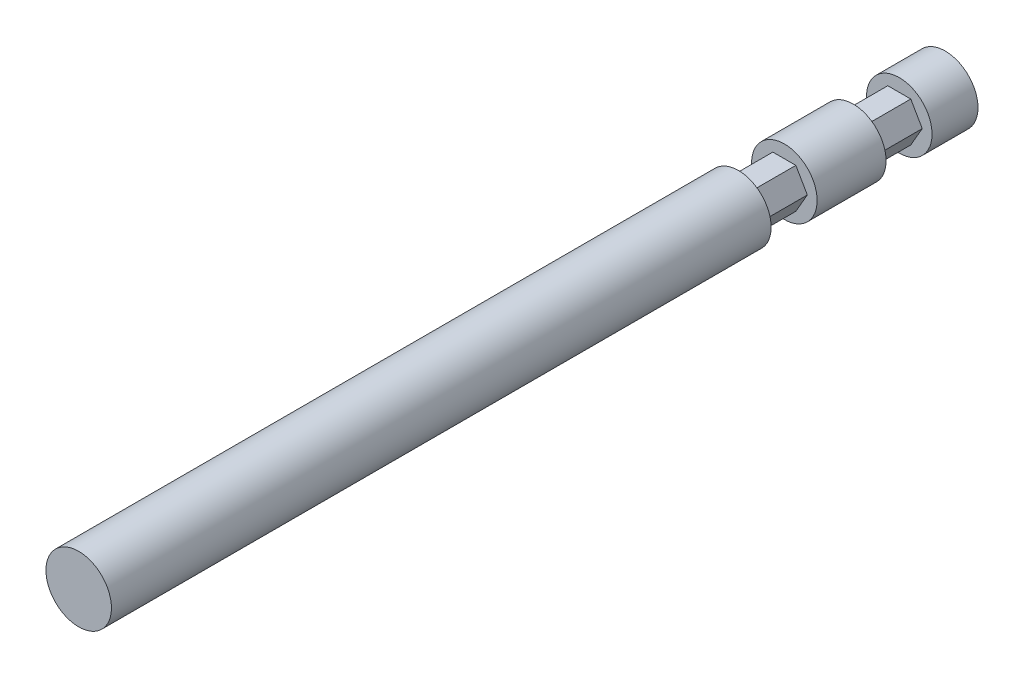
ISO-10303-21;
HEADER;
FILE_DESCRIPTION(('STEP AP214'),'2;1');
FILE_NAME('part.step','',(''),(''),'','','');
FILE_SCHEMA(('AUTOMOTIVE_DESIGN { 1 0 10303 214 1 1 1 1 }'));
ENDSEC;
DATA;
#1=APPLICATION_CONTEXT('core data for automotive mechanical design processes');
#2=APPLICATION_PROTOCOL_DEFINITION('international standard','automotive_design',2000,#1);
#3=PRODUCT_CONTEXT('',#1,'mechanical');
#4=PRODUCT('Part','Part','',(#3));
#5=PRODUCT_RELATED_PRODUCT_CATEGORY('part','',(#4));
#6=PRODUCT_DEFINITION_FORMATION('','',#4);
#7=PRODUCT_DEFINITION_CONTEXT('part definition',#1,'design');
#8=PRODUCT_DEFINITION('design','',#6,#7);
#9=PRODUCT_DEFINITION_SHAPE('','',#8);
#10=(LENGTH_UNIT() NAMED_UNIT(*) SI_UNIT(.MILLI.,.METRE.));
#11=(NAMED_UNIT(*) PLANE_ANGLE_UNIT() SI_UNIT($,.RADIAN.));
#12=(NAMED_UNIT(*) SI_UNIT($,.STERADIAN.) SOLID_ANGLE_UNIT());
#13=UNCERTAINTY_MEASURE_WITH_UNIT(LENGTH_MEASURE(1.E-05),#10,'distance_accuracy_value','');
#14=(GEOMETRIC_REPRESENTATION_CONTEXT(3) GLOBAL_UNCERTAINTY_ASSIGNED_CONTEXT((#13)) GLOBAL_UNIT_ASSIGNED_CONTEXT((#10,
#11,#12)) REPRESENTATION_CONTEXT('',''));
#15=CARTESIAN_POINT('',(0.,0.,0.));
#16=DIRECTION('',(0.,0.,1.));
#17=DIRECTION('',(1.,0.,0.));
#18=AXIS2_PLACEMENT_3D('',#15,#16,#17);
#19=CARTESIAN_POINT('',(0.,0.,4.));
#20=DIRECTION('',(0.,0.,-1.));
#21=DIRECTION('',(-1.,0.,0.));
#22=AXIS2_PLACEMENT_3D('',#19,#20,#21);
#23=CYLINDRICAL_SURFACE('',#22,2.85);
#24=CARTESIAN_POINT('',(0.,0.,4.));
#25=DIRECTION('',(0.,0.,1.));
#26=DIRECTION('',(1.,0.,0.));
#27=AXIS2_PLACEMENT_3D('',#24,#25,#26);
#28=CIRCLE('',#27,2.85);
#29=CARTESIAN_POINT('',(2.85,0.,4.));
#30=VERTEX_POINT('',#29);
#31=EDGE_CURVE('E11',#30,#30,#28,.T.);
#32=ORIENTED_EDGE('',*,*,#31,.F.);
#33=EDGE_LOOP('',(#32));
#34=FACE_BOUND('',#33,.T.);
#35=CARTESIAN_POINT('',(0.,0.,0.));
#36=DIRECTION('',(0.,0.,1.));
#37=DIRECTION('',(1.,0.,0.));
#38=AXIS2_PLACEMENT_3D('',#35,#36,#37);
#39=CIRCLE('',#38,2.85);
#40=CARTESIAN_POINT('',(2.85,0.,0.));
#41=VERTEX_POINT('',#40);
#42=EDGE_CURVE('E44',#41,#41,#39,.T.);
#43=ORIENTED_EDGE('',*,*,#42,.T.);
#44=EDGE_LOOP('',(#43));
#45=FACE_BOUND('',#44,.T.);
#46=ADVANCED_FACE('F41',(#34,#45),#23,.T.);
#47=CARTESIAN_POINT('',(0.,0.,4.));
#48=DIRECTION('',(0.,0.,1.));
#49=DIRECTION('',(1.,0.,0.));
#50=AXIS2_PLACEMENT_3D('',#47,#48,#49);
#51=PLANE('',#50);
#52=DIRECTION('',(0.5,0.866025403784439,0.));
#53=VECTOR('',#52,1.);
#54=CARTESIAN_POINT('',(1.,-1.73205080756888,4.));
#55=LINE('',#54,#53);
#56=CARTESIAN_POINT('',(1.,-1.73205080756888,4.));
#57=VERTEX_POINT('',#56);
#58=CARTESIAN_POINT('',(2.,0.,4.));
#59=VERTEX_POINT('',#58);
#60=EDGE_CURVE('E202',#57,#59,#55,.T.);
#61=ORIENTED_EDGE('',*,*,#60,.F.);
#62=DIRECTION('',(1.,0.,0.));
#63=VECTOR('',#62,1.);
#64=CARTESIAN_POINT('',(-1.,-1.73205080756888,4.));
#65=LINE('',#64,#63);
#66=CARTESIAN_POINT('',(-1.,-1.73205080756888,4.));
#67=VERTEX_POINT('',#66);
#68=EDGE_CURVE('E211',#67,#57,#65,.T.);
#69=ORIENTED_EDGE('',*,*,#68,.F.);
#70=DIRECTION('',(0.5,-0.866025403784439,0.));
#71=VECTOR('',#70,1.);
#72=CARTESIAN_POINT('',(-2.,0.,4.));
#73=LINE('',#72,#71);
#74=CARTESIAN_POINT('',(-2.,0.,4.));
#75=VERTEX_POINT('',#74);
#76=EDGE_CURVE('E247',#75,#67,#73,.T.);
#77=ORIENTED_EDGE('',*,*,#76,.F.);
#78=DIRECTION('',(-0.5,-0.866025403784439,0.));
#79=VECTOR('',#78,1.);
#80=CARTESIAN_POINT('',(-1.,1.73205080756888,4.));
#81=LINE('',#80,#79);
#82=CARTESIAN_POINT('',(-1.,1.73205080756888,4.));
#83=VERTEX_POINT('',#82);
#84=EDGE_CURVE('E243',#83,#75,#81,.T.);
#85=ORIENTED_EDGE('',*,*,#84,.F.);
#86=DIRECTION('',(-1.,0.,0.));
#87=VECTOR('',#86,1.);
#88=CARTESIAN_POINT('',(1.,1.73205080756888,4.));
#89=LINE('',#88,#87);
#90=CARTESIAN_POINT('',(1.,1.73205080756888,4.));
#91=VERTEX_POINT('',#90);
#92=EDGE_CURVE('E239',#91,#83,#89,.T.);
#93=ORIENTED_EDGE('',*,*,#92,.F.);
#94=DIRECTION('',(-0.5,0.866025403784439,0.));
#95=VECTOR('',#94,1.);
#96=CARTESIAN_POINT('',(2.,0.,4.));
#97=LINE('',#96,#95);
#98=EDGE_CURVE('E235',#59,#91,#97,.T.);
#99=ORIENTED_EDGE('',*,*,#98,.F.);
#100=EDGE_LOOP('',(#61,#69,#77,#85,#93,#99));
#101=FACE_BOUND('',#100,.T.);
#102=ORIENTED_EDGE('',*,*,#31,.T.);
#103=EDGE_LOOP('',(#102));
#104=FACE_BOUND('',#103,.T.);
#105=ADVANCED_FACE('F286',(#101,#104),#51,.T.);
#106=CARTESIAN_POINT('',(0.,0.,0.));
#107=DIRECTION('',(0.,0.,1.));
#108=DIRECTION('',(1.,0.,0.));
#109=AXIS2_PLACEMENT_3D('',#106,#107,#108);
#110=PLANE('',#109);
#111=ORIENTED_EDGE('',*,*,#42,.F.);
#112=EDGE_LOOP('',(#111));
#113=FACE_BOUND('',#112,.T.);
#114=ADVANCED_FACE('F283',(#113),#110,.F.);
#115=CARTESIAN_POINT('',(1.,-1.73205080756888,8.));
#116=DIRECTION('',(-0.866025403784439,0.5,0.));
#117=DIRECTION('',(-0.5,-0.866025403784439,0.));
#118=AXIS2_PLACEMENT_3D('',#115,#116,#117);
#119=PLANE('',#118);
#120=ORIENTED_EDGE('',*,*,#60,.T.);
#121=DIRECTION('',(0.,0.,-1.));
#122=VECTOR('',#121,1.);
#123=CARTESIAN_POINT('',(2.,0.,8.));
#124=LINE('',#123,#122);
#125=CARTESIAN_POINT('',(2.,0.,8.));
#126=VERTEX_POINT('',#125);
#127=EDGE_CURVE('E273',#126,#59,#124,.T.);
#128=ORIENTED_EDGE('',*,*,#127,.F.);
#129=DIRECTION('',(0.5,0.866025403784439,0.));
#130=VECTOR('',#129,1.);
#131=CARTESIAN_POINT('',(1.,-1.73205080756888,8.));
#132=LINE('',#131,#130);
#133=CARTESIAN_POINT('',(1.,-1.73205080756888,8.));
#134=VERTEX_POINT('',#133);
#135=EDGE_CURVE('E206',#134,#126,#132,.T.);
#136=ORIENTED_EDGE('',*,*,#135,.F.);
#137=DIRECTION('',(0.,0.,-1.));
#138=VECTOR('',#137,1.);
#139=CARTESIAN_POINT('',(1.,-1.73205080756888,8.));
#140=LINE('',#139,#138);
#141=EDGE_CURVE('E231',#134,#57,#140,.T.);
#142=ORIENTED_EDGE('',*,*,#141,.T.);
#143=EDGE_LOOP('',(#120,#128,#136,#142));
#144=FACE_BOUND('',#143,.T.);
#145=ADVANCED_FACE('F285',(#144),#119,.F.);
#146=CARTESIAN_POINT('',(2.,0.,8.));
#147=DIRECTION('',(-0.866025403784439,-0.5,0.));
#148=DIRECTION('',(0.5,-0.866025403784439,0.));
#149=AXIS2_PLACEMENT_3D('',#146,#147,#148);
#150=PLANE('',#149);
#151=ORIENTED_EDGE('',*,*,#98,.T.);
#152=DIRECTION('',(0.,0.,-1.));
#153=VECTOR('',#152,1.);
#154=CARTESIAN_POINT('',(1.,1.73205080756888,8.));
#155=LINE('',#154,#153);
#156=CARTESIAN_POINT('',(1.,1.73205080756888,8.));
#157=VERTEX_POINT('',#156);
#158=EDGE_CURVE('E269',#157,#91,#155,.T.);
#159=ORIENTED_EDGE('',*,*,#158,.F.);
#160=DIRECTION('',(-0.5,0.866025403784439,0.));
#161=VECTOR('',#160,1.);
#162=CARTESIAN_POINT('',(2.,0.,8.));
#163=LINE('',#162,#161);
#164=EDGE_CURVE('E210',#126,#157,#163,.T.);
#165=ORIENTED_EDGE('',*,*,#164,.F.);
#166=ORIENTED_EDGE('',*,*,#127,.T.);
#167=EDGE_LOOP('',(#151,#159,#165,#166));
#168=FACE_BOUND('',#167,.T.);
#169=ADVANCED_FACE('F291',(#168),#150,.F.);
#170=CARTESIAN_POINT('',(1.,1.73205080756888,8.));
#171=DIRECTION('',(0.,-1.,0.));
#172=DIRECTION('',(1.,0.,0.));
#173=AXIS2_PLACEMENT_3D('',#170,#171,#172);
#174=PLANE('',#173);
#175=ORIENTED_EDGE('',*,*,#92,.T.);
#176=DIRECTION('',(0.,0.,-1.));
#177=VECTOR('',#176,1.);
#178=CARTESIAN_POINT('',(-1.,1.73205080756888,8.));
#179=LINE('',#178,#177);
#180=CARTESIAN_POINT('',(-1.,1.73205080756888,8.));
#181=VERTEX_POINT('',#180);
#182=EDGE_CURVE('E265',#181,#83,#179,.T.);
#183=ORIENTED_EDGE('',*,*,#182,.F.);
#184=DIRECTION('',(-1.,0.,0.));
#185=VECTOR('',#184,1.);
#186=CARTESIAN_POINT('',(1.,1.73205080756888,8.));
#187=LINE('',#186,#185);
#188=EDGE_CURVE('E215',#157,#181,#187,.T.);
#189=ORIENTED_EDGE('',*,*,#188,.F.);
#190=ORIENTED_EDGE('',*,*,#158,.T.);
#191=EDGE_LOOP('',(#175,#183,#189,#190));
#192=FACE_BOUND('',#191,.T.);
#193=ADVANCED_FACE('F323',(#192),#174,.F.);
#194=CARTESIAN_POINT('',(-1.,1.73205080756888,8.));
#195=DIRECTION('',(0.866025403784439,-0.5,0.));
#196=DIRECTION('',(0.5,0.866025403784439,0.));
#197=AXIS2_PLACEMENT_3D('',#194,#195,#196);
#198=PLANE('',#197);
#199=ORIENTED_EDGE('',*,*,#84,.T.);
#200=DIRECTION('',(0.,0.,-1.));
#201=VECTOR('',#200,1.);
#202=CARTESIAN_POINT('',(-2.,0.,8.));
#203=LINE('',#202,#201);
#204=CARTESIAN_POINT('',(-2.,0.,8.));
#205=VERTEX_POINT('',#204);
#206=EDGE_CURVE('E261',#205,#75,#203,.T.);
#207=ORIENTED_EDGE('',*,*,#206,.F.);
#208=DIRECTION('',(-0.5,-0.866025403784439,0.));
#209=VECTOR('',#208,1.);
#210=CARTESIAN_POINT('',(-1.,1.73205080756888,8.));
#211=LINE('',#210,#209);
#212=EDGE_CURVE('E219',#181,#205,#211,.T.);
#213=ORIENTED_EDGE('',*,*,#212,.F.);
#214=ORIENTED_EDGE('',*,*,#182,.T.);
#215=EDGE_LOOP('',(#199,#207,#213,#214));
#216=FACE_BOUND('',#215,.T.);
#217=ADVANCED_FACE('F332',(#216),#198,.F.);
#218=CARTESIAN_POINT('',(-2.,0.,8.));
#219=DIRECTION('',(0.866025403784439,0.5,0.));
#220=DIRECTION('',(-0.5,0.866025403784439,0.));
#221=AXIS2_PLACEMENT_3D('',#218,#219,#220);
#222=PLANE('',#221);
#223=ORIENTED_EDGE('',*,*,#76,.T.);
#224=DIRECTION('',(0.,0.,-1.));
#225=VECTOR('',#224,1.);
#226=CARTESIAN_POINT('',(-1.,-1.73205080756888,8.));
#227=LINE('',#226,#225);
#228=CARTESIAN_POINT('',(-1.,-1.73205080756888,8.));
#229=VERTEX_POINT('',#228);
#230=EDGE_CURVE('E257',#229,#67,#227,.T.);
#231=ORIENTED_EDGE('',*,*,#230,.F.);
#232=DIRECTION('',(0.5,-0.866025403784439,0.));
#233=VECTOR('',#232,1.);
#234=CARTESIAN_POINT('',(-2.,0.,8.));
#235=LINE('',#234,#233);
#236=EDGE_CURVE('E223',#205,#229,#235,.T.);
#237=ORIENTED_EDGE('',*,*,#236,.F.);
#238=ORIENTED_EDGE('',*,*,#206,.T.);
#239=EDGE_LOOP('',(#223,#231,#237,#238));
#240=FACE_BOUND('',#239,.T.);
#241=ADVANCED_FACE('F342',(#240),#222,.F.);
#242=CARTESIAN_POINT('',(-1.,-1.73205080756888,8.));
#243=DIRECTION('',(0.,1.,0.));
#244=DIRECTION('',(-1.,0.,0.));
#245=AXIS2_PLACEMENT_3D('',#242,#243,#244);
#246=PLANE('',#245);
#247=ORIENTED_EDGE('',*,*,#68,.T.);
#248=ORIENTED_EDGE('',*,*,#141,.F.);
#249=DIRECTION('',(1.,0.,0.));
#250=VECTOR('',#249,1.);
#251=CARTESIAN_POINT('',(-1.,-1.73205080756888,8.));
#252=LINE('',#251,#250);
#253=EDGE_CURVE('E227',#229,#134,#252,.T.);
#254=ORIENTED_EDGE('',*,*,#253,.F.);
#255=ORIENTED_EDGE('',*,*,#230,.T.);
#256=EDGE_LOOP('',(#247,#248,#254,#255));
#257=FACE_BOUND('',#256,.T.);
#258=ADVANCED_FACE('F352',(#257),#246,.F.);
#259=CARTESIAN_POINT('',(0.,0.,8.));
#260=DIRECTION('',(0.,0.,1.));
#261=DIRECTION('',(1.,0.,0.));
#262=AXIS2_PLACEMENT_3D('',#259,#260,#261);
#263=PLANE('',#262);
#264=CARTESIAN_POINT('',(0.,0.,8.));
#265=DIRECTION('',(0.,0.,1.));
#266=DIRECTION('',(1.,0.,0.));
#267=AXIS2_PLACEMENT_3D('',#264,#265,#266);
#268=CIRCLE('',#267,2.85);
#269=CARTESIAN_POINT('',(2.85,0.,8.));
#270=VERTEX_POINT('',#269);
#271=EDGE_CURVE('E197',#270,#270,#268,.T.);
#272=ORIENTED_EDGE('',*,*,#271,.F.);
#273=EDGE_LOOP('',(#272));
#274=FACE_BOUND('',#273,.T.);
#275=ORIENTED_EDGE('',*,*,#253,.T.);
#276=ORIENTED_EDGE('',*,*,#135,.T.);
#277=ORIENTED_EDGE('',*,*,#164,.T.);
#278=ORIENTED_EDGE('',*,*,#188,.T.);
#279=ORIENTED_EDGE('',*,*,#212,.T.);
#280=ORIENTED_EDGE('',*,*,#236,.T.);
#281=EDGE_LOOP('',(#275,#276,#277,#278,#279,#280));
#282=FACE_BOUND('',#281,.T.);
#283=ADVANCED_FACE('F362',(#274,#282),#263,.F.);
#284=CARTESIAN_POINT('',(0.,0.,14.));
#285=DIRECTION('',(0.,0.,-1.));
#286=DIRECTION('',(-1.,0.,0.));
#287=AXIS2_PLACEMENT_3D('',#284,#285,#286);
#288=CYLINDRICAL_SURFACE('',#287,2.85);
#289=CARTESIAN_POINT('',(0.,0.,14.));
#290=DIRECTION('',(0.,0.,1.));
#291=DIRECTION('',(1.,0.,0.));
#292=AXIS2_PLACEMENT_3D('',#289,#290,#291);
#293=CIRCLE('',#292,2.85);
#294=CARTESIAN_POINT('',(2.85,0.,14.));
#295=VERTEX_POINT('',#294);
#296=EDGE_CURVE('E198',#295,#295,#293,.T.);
#297=ORIENTED_EDGE('',*,*,#296,.F.);
#298=EDGE_LOOP('',(#297));
#299=FACE_BOUND('',#298,.T.);
#300=ORIENTED_EDGE('',*,*,#271,.T.);
#301=EDGE_LOOP('',(#300));
#302=FACE_BOUND('',#301,.T.);
#303=ADVANCED_FACE('F372',(#299,#302),#288,.T.);
#304=CARTESIAN_POINT('',(0.,0.,14.));
#305=DIRECTION('',(0.,0.,1.));
#306=DIRECTION('',(1.,0.,0.));
#307=AXIS2_PLACEMENT_3D('',#304,#305,#306);
#308=PLANE('',#307);
#309=DIRECTION('',(0.5,0.866025403784439,0.));
#310=VECTOR('',#309,1.);
#311=CARTESIAN_POINT('',(1.,-1.73205080756888,14.));
#312=LINE('',#311,#310);
#313=CARTESIAN_POINT('',(1.,-1.73205080756888,14.));
#314=VERTEX_POINT('',#313);
#315=CARTESIAN_POINT('',(2.,0.,14.));
#316=VERTEX_POINT('',#315);
#317=EDGE_CURVE('E56',#314,#316,#312,.T.);
#318=ORIENTED_EDGE('',*,*,#317,.F.);
#319=DIRECTION('',(1.,0.,0.));
#320=VECTOR('',#319,1.);
#321=CARTESIAN_POINT('',(-1.,-1.73205080756888,14.));
#322=LINE('',#321,#320);
#323=CARTESIAN_POINT('',(-1.,-1.73205080756888,14.));
#324=VERTEX_POINT('',#323);
#325=EDGE_CURVE('E60',#324,#314,#322,.T.);
#326=ORIENTED_EDGE('',*,*,#325,.F.);
#327=DIRECTION('',(0.5,-0.866025403784439,0.));
#328=VECTOR('',#327,1.);
#329=CARTESIAN_POINT('',(-2.,0.,14.));
#330=LINE('',#329,#328);
#331=CARTESIAN_POINT('',(-2.,0.,14.));
#332=VERTEX_POINT('',#331);
#333=EDGE_CURVE('E176',#332,#324,#330,.T.);
#334=ORIENTED_EDGE('',*,*,#333,.F.);
#335=DIRECTION('',(-0.5,-0.866025403784438,0.));
#336=VECTOR('',#335,1.);
#337=CARTESIAN_POINT('',(-0.999999999999999,1.73205080756888,14.));
#338=LINE('',#337,#336);
#339=CARTESIAN_POINT('',(-0.999999999999999,1.73205080756888,14.));
#340=VERTEX_POINT('',#339);
#341=EDGE_CURVE('E172',#340,#332,#338,.T.);
#342=ORIENTED_EDGE('',*,*,#341,.F.);
#343=DIRECTION('',(-1.,0.,0.));
#344=VECTOR('',#343,1.);
#345=CARTESIAN_POINT('',(0.999999999999999,1.73205080756888,14.));
#346=LINE('',#345,#344);
#347=CARTESIAN_POINT('',(0.999999999999999,1.73205080756888,14.));
#348=VERTEX_POINT('',#347);
#349=EDGE_CURVE('E168',#348,#340,#346,.T.);
#350=ORIENTED_EDGE('',*,*,#349,.F.);
#351=DIRECTION('',(-0.5,0.866025403784439,0.));
#352=VECTOR('',#351,1.);
#353=CARTESIAN_POINT('',(2.,0.,14.));
#354=LINE('',#353,#352);
#355=EDGE_CURVE('E163',#316,#348,#354,.T.);
#356=ORIENTED_EDGE('',*,*,#355,.F.);
#357=EDGE_LOOP('',(#318,#326,#334,#342,#350,#356));
#358=FACE_BOUND('',#357,.T.);
#359=ORIENTED_EDGE('',*,*,#296,.T.);
#360=EDGE_LOOP('',(#359));
#361=FACE_BOUND('',#360,.T.);
#362=ADVANCED_FACE('F382',(#358,#361),#308,.T.);
#363=CARTESIAN_POINT('',(1.,-1.73205080756888,18.));
#364=DIRECTION('',(-0.866025403784439,0.5,0.));
#365=DIRECTION('',(-0.5,-0.866025403784439,0.));
#366=AXIS2_PLACEMENT_3D('',#363,#364,#365);
#367=PLANE('',#366);
#368=ORIENTED_EDGE('',*,*,#317,.T.);
#369=DIRECTION('',(0.,0.,-1.));
#370=VECTOR('',#369,1.);
#371=CARTESIAN_POINT('',(2.,0.,18.));
#372=LINE('',#371,#370);
#373=CARTESIAN_POINT('',(2.,0.,18.));
#374=VERTEX_POINT('',#373);
#375=EDGE_CURVE('E134',#374,#316,#372,.T.);
#376=ORIENTED_EDGE('',*,*,#375,.F.);
#377=DIRECTION('',(0.5,0.866025403784439,0.));
#378=VECTOR('',#377,1.);
#379=CARTESIAN_POINT('',(1.,-1.73205080756888,18.));
#380=LINE('',#379,#378);
#381=CARTESIAN_POINT('',(1.,-1.73205080756888,18.));
#382=VERTEX_POINT('',#381);
#383=EDGE_CURVE('E129',#382,#374,#380,.T.);
#384=ORIENTED_EDGE('',*,*,#383,.F.);
#385=DIRECTION('',(0.,0.,-1.));
#386=VECTOR('',#385,1.);
#387=CARTESIAN_POINT('',(1.,-1.73205080756888,18.));
#388=LINE('',#387,#386);
#389=EDGE_CURVE('E132',#382,#314,#388,.T.);
#390=ORIENTED_EDGE('',*,*,#389,.T.);
#391=EDGE_LOOP('',(#368,#376,#384,#390));
#392=FACE_BOUND('',#391,.T.);
#393=ADVANCED_FACE('F131',(#392),#367,.F.);
#394=CARTESIAN_POINT('',(2.,0.,18.));
#395=DIRECTION('',(-0.866025403784439,-0.5,0.));
#396=DIRECTION('',(0.5,-0.866025403784439,0.));
#397=AXIS2_PLACEMENT_3D('',#394,#395,#396);
#398=PLANE('',#397);
#399=ORIENTED_EDGE('',*,*,#355,.T.);
#400=DIRECTION('',(0.,0.,-1.));
#401=VECTOR('',#400,1.);
#402=CARTESIAN_POINT('',(0.999999999999999,1.73205080756888,18.));
#403=LINE('',#402,#401);
#404=CARTESIAN_POINT('',(0.999999999999999,1.73205080756888,18.));
#405=VERTEX_POINT('',#404);
#406=EDGE_CURVE('E191',#405,#348,#403,.T.);
#407=ORIENTED_EDGE('',*,*,#406,.F.);
#408=DIRECTION('',(-0.5,0.866025403784439,0.));
#409=VECTOR('',#408,1.);
#410=CARTESIAN_POINT('',(2.,0.,18.));
#411=LINE('',#410,#409);
#412=EDGE_CURVE('E139',#374,#405,#411,.T.);
#413=ORIENTED_EDGE('',*,*,#412,.F.);
#414=ORIENTED_EDGE('',*,*,#375,.T.);
#415=EDGE_LOOP('',(#399,#407,#413,#414));
#416=FACE_BOUND('',#415,.T.);
#417=ADVANCED_FACE('F400',(#416),#398,.F.);
#418=CARTESIAN_POINT('',(0.999999999999999,1.73205080756888,18.));
#419=DIRECTION('',(0.,-1.,0.));
#420=DIRECTION('',(1.,0.,0.));
#421=AXIS2_PLACEMENT_3D('',#418,#419,#420);
#422=PLANE('',#421);
#423=ORIENTED_EDGE('',*,*,#349,.T.);
#424=DIRECTION('',(0.,0.,-1.));
#425=VECTOR('',#424,1.);
#426=CARTESIAN_POINT('',(-0.999999999999999,1.73205080756888,18.));
#427=LINE('',#426,#425);
#428=CARTESIAN_POINT('',(-0.999999999999999,1.73205080756888,18.));
#429=VERTEX_POINT('',#428);
#430=EDGE_CURVE('E187',#429,#340,#427,.T.);
#431=ORIENTED_EDGE('',*,*,#430,.F.);
#432=DIRECTION('',(-1.,0.,0.));
#433=VECTOR('',#432,1.);
#434=CARTESIAN_POINT('',(0.999999999999999,1.73205080756888,18.));
#435=LINE('',#434,#433);
#436=EDGE_CURVE('E491',#405,#429,#435,.T.);
#437=ORIENTED_EDGE('',*,*,#436,.F.);
#438=ORIENTED_EDGE('',*,*,#406,.T.);
#439=EDGE_LOOP('',(#423,#431,#437,#438));
#440=FACE_BOUND('',#439,.T.);
#441=ADVANCED_FACE('F409',(#440),#422,.F.);
#442=CARTESIAN_POINT('',(-0.999999999999999,1.73205080756888,18.));
#443=DIRECTION('',(0.866025403784438,-0.5,0.));
#444=DIRECTION('',(0.5,0.866025403784439,0.));
#445=AXIS2_PLACEMENT_3D('',#442,#443,#444);
#446=PLANE('',#445);
#447=ORIENTED_EDGE('',*,*,#341,.T.);
#448=DIRECTION('',(0.,0.,-1.));
#449=VECTOR('',#448,1.);
#450=CARTESIAN_POINT('',(-2.,0.,18.));
#451=LINE('',#450,#449);
#452=CARTESIAN_POINT('',(-2.,0.,18.));
#453=VERTEX_POINT('',#452);
#454=EDGE_CURVE('E183',#453,#332,#451,.T.);
#455=ORIENTED_EDGE('',*,*,#454,.F.);
#456=DIRECTION('',(-0.5,-0.866025403784438,0.));
#457=VECTOR('',#456,1.);
#458=CARTESIAN_POINT('',(-0.999999999999999,1.73205080756888,18.));
#459=LINE('',#458,#457);
#460=EDGE_CURVE('E157',#429,#453,#459,.T.);
#461=ORIENTED_EDGE('',*,*,#460,.F.);
#462=ORIENTED_EDGE('',*,*,#430,.T.);
#463=EDGE_LOOP('',(#447,#455,#461,#462));
#464=FACE_BOUND('',#463,.T.);
#465=ADVANCED_FACE('F419',(#464),#446,.F.);
#466=CARTESIAN_POINT('',(-2.,0.,18.));
#467=DIRECTION('',(0.866025403784439,0.5,0.));
#468=DIRECTION('',(-0.5,0.866025403784439,0.));
#469=AXIS2_PLACEMENT_3D('',#466,#467,#468);
#470=PLANE('',#469);
#471=ORIENTED_EDGE('',*,*,#333,.T.);
#472=DIRECTION('',(0.,0.,-1.));
#473=VECTOR('',#472,1.);
#474=CARTESIAN_POINT('',(-1.,-1.73205080756888,18.));
#475=LINE('',#474,#473);
#476=CARTESIAN_POINT('',(-1.,-1.73205080756888,18.));
#477=VERTEX_POINT('',#476);
#478=EDGE_CURVE('E148',#477,#324,#475,.T.);
#479=ORIENTED_EDGE('',*,*,#478,.F.);
#480=DIRECTION('',(0.5,-0.866025403784439,0.));
#481=VECTOR('',#480,1.);
#482=CARTESIAN_POINT('',(-2.,0.,18.));
#483=LINE('',#482,#481);
#484=EDGE_CURVE('E153',#453,#477,#483,.T.);
#485=ORIENTED_EDGE('',*,*,#484,.F.);
#486=ORIENTED_EDGE('',*,*,#454,.T.);
#487=EDGE_LOOP('',(#471,#479,#485,#486));
#488=FACE_BOUND('',#487,.T.);
#489=ADVANCED_FACE('F429',(#488),#470,.F.);
#490=CARTESIAN_POINT('',(-1.,-1.73205080756888,18.));
#491=DIRECTION('',(0.,1.,0.));
#492=DIRECTION('',(-1.,0.,0.));
#493=AXIS2_PLACEMENT_3D('',#490,#491,#492);
#494=PLANE('',#493);
#495=ORIENTED_EDGE('',*,*,#325,.T.);
#496=ORIENTED_EDGE('',*,*,#389,.F.);
#497=DIRECTION('',(1.,0.,0.));
#498=VECTOR('',#497,1.);
#499=CARTESIAN_POINT('',(-1.,-1.73205080756888,18.));
#500=LINE('',#499,#498);
#501=EDGE_CURVE('E145',#477,#382,#500,.T.);
#502=ORIENTED_EDGE('',*,*,#501,.F.);
#503=ORIENTED_EDGE('',*,*,#478,.T.);
#504=EDGE_LOOP('',(#495,#496,#502,#503));
#505=FACE_BOUND('',#504,.T.);
#506=ADVANCED_FACE('F143',(#505),#494,.F.);
#507=CARTESIAN_POINT('',(0.,0.,18.));
#508=DIRECTION('',(0.,0.,1.));
#509=DIRECTION('',(1.,0.,0.));
#510=AXIS2_PLACEMENT_3D('',#507,#508,#509);
#511=PLANE('',#510);
#512=CARTESIAN_POINT('',(0.,0.,18.));
#513=DIRECTION('',(0.,0.,1.));
#514=DIRECTION('',(1.,0.,0.));
#515=AXIS2_PLACEMENT_3D('',#512,#513,#514);
#516=CIRCLE('',#515,2.85);
#517=CARTESIAN_POINT('',(2.85,0.,18.));
#518=VERTEX_POINT('',#517);
#519=EDGE_CURVE('E483',#518,#518,#516,.T.);
#520=ORIENTED_EDGE('',*,*,#519,.F.);
#521=EDGE_LOOP('',(#520));
#522=FACE_BOUND('',#521,.T.);
#523=ORIENTED_EDGE('',*,*,#501,.T.);
#524=ORIENTED_EDGE('',*,*,#383,.T.);
#525=ORIENTED_EDGE('',*,*,#412,.T.);
#526=ORIENTED_EDGE('',*,*,#436,.T.);
#527=ORIENTED_EDGE('',*,*,#460,.T.);
#528=ORIENTED_EDGE('',*,*,#484,.T.);
#529=EDGE_LOOP('',(#523,#524,#525,#526,#527,#528));
#530=FACE_BOUND('',#529,.T.);
#531=ADVANCED_FACE('F150',(#522,#530),#511,.F.);
#532=CARTESIAN_POINT('',(0.,0.,75.4));
#533=DIRECTION('',(0.,0.,-1.));
#534=DIRECTION('',(-1.,0.,0.));
#535=AXIS2_PLACEMENT_3D('',#532,#533,#534);
#536=CYLINDRICAL_SURFACE('',#535,2.85);
#537=CARTESIAN_POINT('',(0.,0.,75.4));
#538=DIRECTION('',(0.,0.,1.));
#539=DIRECTION('',(1.,0.,0.));
#540=AXIS2_PLACEMENT_3D('',#537,#538,#539);
#541=CIRCLE('',#540,2.85);
#542=CARTESIAN_POINT('',(2.85,0.,75.4));
#543=VERTEX_POINT('',#542);
#544=EDGE_CURVE('E164',#543,#543,#541,.T.);
#545=ORIENTED_EDGE('',*,*,#544,.F.);
#546=EDGE_LOOP('',(#545));
#547=FACE_BOUND('',#546,.T.);
#548=ORIENTED_EDGE('',*,*,#519,.T.);
#549=EDGE_LOOP('',(#548));
#550=FACE_BOUND('',#549,.T.);
#551=ADVANCED_FACE('F456',(#547,#550),#536,.T.);
#552=CARTESIAN_POINT('',(0.,0.,75.4));
#553=DIRECTION('',(0.,0.,1.));
#554=DIRECTION('',(1.,0.,0.));
#555=AXIS2_PLACEMENT_3D('',#552,#553,#554);
#556=PLANE('',#555);
#557=ORIENTED_EDGE('',*,*,#544,.T.);
#558=EDGE_LOOP('',(#557));
#559=FACE_BOUND('',#558,.T.);
#560=ADVANCED_FACE('F466',(#559),#556,.T.);
#561=CLOSED_SHELL('',(#46,#105,#114,#145,#169,#193,#217,#241,#258,#283,#303,#362,#393,#417,#441,
#465,#489,#506,#531,#551,#560));
#562=MANIFOLD_SOLID_BREP('B2',#561);
#563=ADVANCED_BREP_SHAPE_REPRESENTATION('',(#18,#562),#14);
#564=SHAPE_DEFINITION_REPRESENTATION(#9,#563);
ENDSEC;
END-ISO-10303-21;
